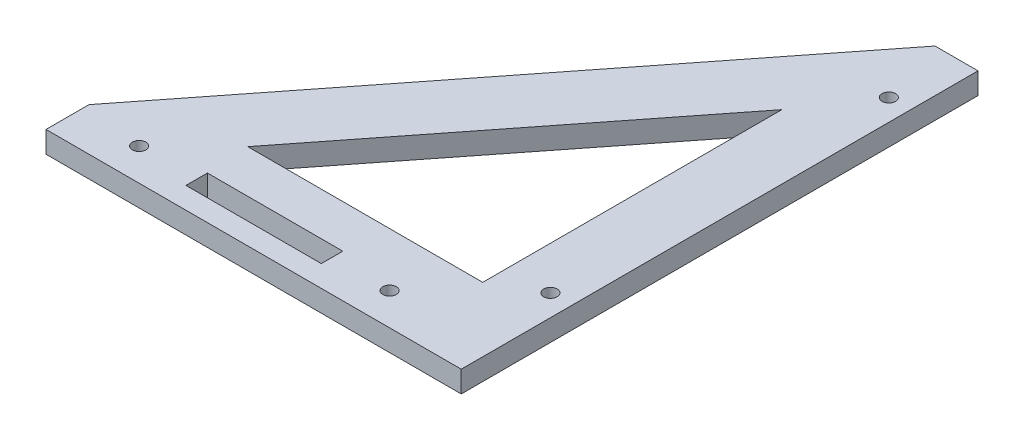
ISO-10303-21;
HEADER;
FILE_DESCRIPTION(('STEP AP214'),'2;1');
FILE_NAME('part.step','',(''),(''),'','','');
FILE_SCHEMA(('AUTOMOTIVE_DESIGN { 1 0 10303 214 1 1 1 1 }'));
ENDSEC;
DATA;
#1=APPLICATION_CONTEXT('core data for automotive mechanical design processes');
#2=APPLICATION_PROTOCOL_DEFINITION('international standard','automotive_design',2000,#1);
#3=PRODUCT_CONTEXT('',#1,'mechanical');
#4=PRODUCT('Part','Part','',(#3));
#5=PRODUCT_RELATED_PRODUCT_CATEGORY('part','',(#4));
#6=PRODUCT_DEFINITION_FORMATION('','',#4);
#7=PRODUCT_DEFINITION_CONTEXT('part definition',#1,'design');
#8=PRODUCT_DEFINITION('design','',#6,#7);
#9=PRODUCT_DEFINITION_SHAPE('','',#8);
#10=(LENGTH_UNIT() NAMED_UNIT(*) SI_UNIT(.MILLI.,.METRE.));
#11=(NAMED_UNIT(*) PLANE_ANGLE_UNIT() SI_UNIT($,.RADIAN.));
#12=(NAMED_UNIT(*) SI_UNIT($,.STERADIAN.) SOLID_ANGLE_UNIT());
#13=UNCERTAINTY_MEASURE_WITH_UNIT(LENGTH_MEASURE(1.E-05),#10,'distance_accuracy_value','');
#14=(GEOMETRIC_REPRESENTATION_CONTEXT(3) GLOBAL_UNCERTAINTY_ASSIGNED_CONTEXT((#13)) GLOBAL_UNIT_ASSIGNED_CONTEXT((#10,
#11,#12)) REPRESENTATION_CONTEXT('',''));
#15=CARTESIAN_POINT('',(0.,0.,0.));
#16=DIRECTION('',(0.,0.,1.));
#17=DIRECTION('',(1.,0.,0.));
#18=AXIS2_PLACEMENT_3D('',#15,#16,#17);
#19=CARTESIAN_POINT('',(55.,3.175,-70.));
#20=DIRECTION('',(0.786318338822423,0.,0.617821551931903));
#21=DIRECTION('',(0.617821551931903,0.,-0.786318338822423));
#22=AXIS2_PLACEMENT_3D('',#19,#20,#21);
#23=PLANE('',#22);
#24=DIRECTION('',(-0.617821551931903,0.,0.786318338822423));
#25=VECTOR('',#24,1.);
#26=CARTESIAN_POINT('',(55.,0.,-70.));
#27=LINE('',#26,#25);
#28=CARTESIAN_POINT('',(55.,0.,-70.));
#29=VERTEX_POINT('',#28);
#30=CARTESIAN_POINT('',(0.,0.,0.));
#31=VERTEX_POINT('',#30);
#32=EDGE_CURVE('E234',#29,#31,#27,.T.);
#33=ORIENTED_EDGE('',*,*,#32,.T.);
#34=DIRECTION('',(0.,-1.,0.));
#35=VECTOR('',#34,1.);
#36=CARTESIAN_POINT('',(0.,3.175,0.));
#37=LINE('',#36,#35);
#38=CARTESIAN_POINT('',(0.,3.175,0.));
#39=VERTEX_POINT('',#38);
#40=EDGE_CURVE('E11',#39,#31,#37,.T.);
#41=ORIENTED_EDGE('',*,*,#40,.F.);
#42=DIRECTION('',(-0.617821551931903,0.,0.786318338822423));
#43=VECTOR('',#42,1.);
#44=CARTESIAN_POINT('',(55.,3.175,-70.));
#45=LINE('',#44,#43);
#46=CARTESIAN_POINT('',(55.,3.175,-70.));
#47=VERTEX_POINT('',#46);
#48=EDGE_CURVE('E235',#47,#39,#45,.T.);
#49=ORIENTED_EDGE('',*,*,#48,.F.);
#50=DIRECTION('',(0.,-1.,0.));
#51=VECTOR('',#50,1.);
#52=CARTESIAN_POINT('',(55.,3.175,-70.));
#53=LINE('',#52,#51);
#54=EDGE_CURVE('E39',#47,#29,#53,.T.);
#55=ORIENTED_EDGE('',*,*,#54,.T.);
#56=EDGE_LOOP('',(#33,#41,#49,#55));
#57=FACE_BOUND('',#56,.T.);
#58=ADVANCED_FACE('F32',(#57),#23,.F.);
#59=CARTESIAN_POINT('',(0.,3.175,0.));
#60=DIRECTION('',(0.,1.,0.));
#61=DIRECTION('',(0.,0.,1.));
#62=AXIS2_PLACEMENT_3D('',#59,#60,#61);
#63=PLANE('',#62);
#64=DIRECTION('',(0.,0.,-1.));
#65=VECTOR('',#64,1.);
#66=CARTESIAN_POINT('',(51.825,3.175,-50.5420178558514));
#67=LINE('',#66,#65);
#68=CARTESIAN_POINT('',(51.825,3.175,-6.35));
#69=VERTEX_POINT('',#68);
#70=CARTESIAN_POINT('',(51.825,3.175,-50.5420178558514));
#71=VERTEX_POINT('',#70);
#72=EDGE_CURVE('E46',#69,#71,#67,.T.);
#73=ORIENTED_EDGE('',*,*,#72,.F.);
#74=DIRECTION('',(1.,0.,0.));
#75=VECTOR('',#74,1.);
#76=CARTESIAN_POINT('',(51.825,3.175,-6.35));
#77=LINE('',#76,#75);
#78=CARTESIAN_POINT('',(17.1027002561168,3.175,-6.34999999999999));
#79=VERTEX_POINT('',#78);
#80=EDGE_CURVE('E135',#79,#69,#77,.T.);
#81=ORIENTED_EDGE('',*,*,#80,.F.);
#82=DIRECTION('',(-0.617821551931903,0.,0.786318338822423));
#83=VECTOR('',#82,1.);
#84=CARTESIAN_POINT('',(17.1027002561168,3.175,-6.34999999999999));
#85=LINE('',#84,#83);
#86=EDGE_CURVE('E138',#71,#79,#85,.T.);
#87=ORIENTED_EDGE('',*,*,#86,.F.);
#88=EDGE_LOOP('',(#73,#81,#87));
#89=FACE_BOUND('',#88,.T.);
#90=CARTESIAN_POINT('',(9.,3.175,1.5875));
#91=DIRECTION('',(0.,1.,0.));
#92=DIRECTION('',(0.,0.,1.));
#93=AXIS2_PLACEMENT_3D('',#90,#91,#92);
#94=CIRCLE('',#93,0.999999999999998);
#95=CARTESIAN_POINT('',(9.,3.175,2.5875));
#96=VERTEX_POINT('',#95);
#97=EDGE_CURVE('E152',#96,#96,#94,.T.);
#98=ORIENTED_EDGE('',*,*,#97,.F.);
#99=EDGE_LOOP('',(#98));
#100=FACE_BOUND('',#99,.T.);
#101=CARTESIAN_POINT('',(46.,3.175,1.5875));
#102=DIRECTION('',(0.,1.,0.));
#103=DIRECTION('',(0.,0.,1.));
#104=AXIS2_PLACEMENT_3D('',#101,#102,#103);
#105=CIRCLE('',#104,0.999999999999998);
#106=CARTESIAN_POINT('',(46.,3.175,2.5875));
#107=VERTEX_POINT('',#106);
#108=EDGE_CURVE('E158',#107,#107,#105,.T.);
#109=ORIENTED_EDGE('',*,*,#108,.F.);
#110=EDGE_LOOP('',(#109));
#111=FACE_BOUND('',#110,.T.);
#112=DIRECTION('',(0.,0.,-1.));
#113=VECTOR('',#112,1.);
#114=CARTESIAN_POINT('',(37.5,3.175,3.175));
#115=LINE('',#114,#113);
#116=CARTESIAN_POINT('',(37.5,3.175,3.175));
#117=VERTEX_POINT('',#116);
#118=CARTESIAN_POINT('',(37.5,3.175,0.));
#119=VERTEX_POINT('',#118);
#120=EDGE_CURVE('E176',#117,#119,#115,.T.);
#121=ORIENTED_EDGE('',*,*,#120,.F.);
#122=DIRECTION('',(1.,0.,0.));
#123=VECTOR('',#122,1.);
#124=CARTESIAN_POINT('',(17.5,3.175,3.175));
#125=LINE('',#124,#123);
#126=CARTESIAN_POINT('',(17.5,3.175,3.175));
#127=VERTEX_POINT('',#126);
#128=EDGE_CURVE('E166',#127,#117,#125,.T.);
#129=ORIENTED_EDGE('',*,*,#128,.F.);
#130=DIRECTION('',(0.,0.,1.));
#131=VECTOR('',#130,1.);
#132=CARTESIAN_POINT('',(17.5,3.175,3.175));
#133=LINE('',#132,#131);
#134=CARTESIAN_POINT('',(17.5,3.175,0.));
#135=VERTEX_POINT('',#134);
#136=EDGE_CURVE('E182',#135,#127,#133,.T.);
#137=ORIENTED_EDGE('',*,*,#136,.F.);
#138=DIRECTION('',(-1.,0.,0.));
#139=VECTOR('',#138,1.);
#140=CARTESIAN_POINT('',(17.5,3.175,0.));
#141=LINE('',#140,#139);
#142=EDGE_CURVE('E178',#119,#135,#141,.T.);
#143=ORIENTED_EDGE('',*,*,#142,.F.);
#144=EDGE_LOOP('',(#121,#129,#137,#143));
#145=FACE_BOUND('',#144,.T.);
#146=CARTESIAN_POINT('',(58.175,3.175,-60.));
#147=DIRECTION('',(0.,1.,0.));
#148=DIRECTION('',(0.,0.,1.));
#149=AXIS2_PLACEMENT_3D('',#146,#147,#148);
#150=CIRCLE('',#149,1.00000000000001);
#151=CARTESIAN_POINT('',(58.175,3.175,-59.));
#152=VERTEX_POINT('',#151);
#153=EDGE_CURVE('E196',#152,#152,#150,.T.);
#154=ORIENTED_EDGE('',*,*,#153,.F.);
#155=EDGE_LOOP('',(#154));
#156=FACE_BOUND('',#155,.T.);
#157=CARTESIAN_POINT('',(58.175,3.175,-10.));
#158=DIRECTION('',(0.,1.,0.));
#159=DIRECTION('',(0.,0.,1.));
#160=AXIS2_PLACEMENT_3D('',#157,#158,#159);
#161=CIRCLE('',#160,0.999999999999998);
#162=CARTESIAN_POINT('',(58.175,3.175,-9.00000000000001));
#163=VERTEX_POINT('',#162);
#164=EDGE_CURVE('E146',#163,#163,#161,.T.);
#165=ORIENTED_EDGE('',*,*,#164,.F.);
#166=EDGE_LOOP('',(#165));
#167=FACE_BOUND('',#166,.T.);
#168=ORIENTED_EDGE('',*,*,#48,.T.);
#169=DIRECTION('',(0.,0.,-1.));
#170=VECTOR('',#169,1.);
#171=CARTESIAN_POINT('',(0.,3.175,0.));
#172=LINE('',#171,#170);
#173=CARTESIAN_POINT('',(0.,3.175,6.35));
#174=VERTEX_POINT('',#173);
#175=EDGE_CURVE('E221',#174,#39,#172,.T.);
#176=ORIENTED_EDGE('',*,*,#175,.F.);
#177=DIRECTION('',(-1.,0.,0.));
#178=VECTOR('',#177,1.);
#179=CARTESIAN_POINT('',(0.,3.175,6.35));
#180=LINE('',#179,#178);
#181=CARTESIAN_POINT('',(61.35,3.175,6.35));
#182=VERTEX_POINT('',#181);
#183=EDGE_CURVE('E224',#182,#174,#180,.T.);
#184=ORIENTED_EDGE('',*,*,#183,.F.);
#185=DIRECTION('',(0.,0.,1.));
#186=VECTOR('',#185,1.);
#187=CARTESIAN_POINT('',(61.35,3.175,6.35));
#188=LINE('',#187,#186);
#189=CARTESIAN_POINT('',(61.35,3.175,-70.));
#190=VERTEX_POINT('',#189);
#191=EDGE_CURVE('E207',#190,#182,#188,.T.);
#192=ORIENTED_EDGE('',*,*,#191,.F.);
#193=DIRECTION('',(1.,0.,0.));
#194=VECTOR('',#193,1.);
#195=CARTESIAN_POINT('',(55.,3.175,-70.));
#196=LINE('',#195,#194);
#197=EDGE_CURVE('E204',#47,#190,#196,.T.);
#198=ORIENTED_EDGE('',*,*,#197,.F.);
#199=EDGE_LOOP('',(#168,#176,#184,#192,#198));
#200=FACE_BOUND('',#199,.T.);
#201=ADVANCED_FACE('F258',(#89,#100,#111,#145,#156,#167,#200),#63,.T.);
#202=CARTESIAN_POINT('',(0.,0.,0.));
#203=DIRECTION('',(0.,1.,0.));
#204=DIRECTION('',(0.,0.,1.));
#205=AXIS2_PLACEMENT_3D('',#202,#203,#204);
#206=PLANE('',#205);
#207=DIRECTION('',(1.,0.,0.));
#208=VECTOR('',#207,1.);
#209=CARTESIAN_POINT('',(51.825,0.,-6.35));
#210=LINE('',#209,#208);
#211=CARTESIAN_POINT('',(17.1027002561168,0.,-6.35));
#212=VERTEX_POINT('',#211);
#213=CARTESIAN_POINT('',(51.825,0.,-6.35));
#214=VERTEX_POINT('',#213);
#215=EDGE_CURVE('E54',#212,#214,#210,.T.);
#216=ORIENTED_EDGE('',*,*,#215,.T.);
#217=DIRECTION('',(0.,0.,-1.));
#218=VECTOR('',#217,1.);
#219=CARTESIAN_POINT('',(51.825,0.,-50.5420178558514));
#220=LINE('',#219,#218);
#221=CARTESIAN_POINT('',(51.825,0.,-50.5420178558514));
#222=VERTEX_POINT('',#221);
#223=EDGE_CURVE('E122',#214,#222,#220,.T.);
#224=ORIENTED_EDGE('',*,*,#223,.T.);
#225=DIRECTION('',(-0.617821551931903,0.,0.786318338822423));
#226=VECTOR('',#225,1.);
#227=CARTESIAN_POINT('',(17.1027002561168,0.,-6.34999999999999));
#228=LINE('',#227,#226);
#229=EDGE_CURVE('E129',#222,#212,#228,.T.);
#230=ORIENTED_EDGE('',*,*,#229,.T.);
#231=EDGE_LOOP('',(#216,#224,#230));
#232=FACE_BOUND('',#231,.T.);
#233=CARTESIAN_POINT('',(9.,0.,1.5875));
#234=DIRECTION('',(0.,1.,0.));
#235=DIRECTION('',(0.,0.,1.));
#236=AXIS2_PLACEMENT_3D('',#233,#234,#235);
#237=CIRCLE('',#236,0.999999999999998);
#238=CARTESIAN_POINT('',(9.,0.,2.5875));
#239=VERTEX_POINT('',#238);
#240=EDGE_CURVE('E148',#239,#239,#237,.T.);
#241=ORIENTED_EDGE('',*,*,#240,.T.);
#242=EDGE_LOOP('',(#241));
#243=FACE_BOUND('',#242,.T.);
#244=CARTESIAN_POINT('',(46.,0.,1.5875));
#245=DIRECTION('',(0.,1.,0.));
#246=DIRECTION('',(0.,0.,1.));
#247=AXIS2_PLACEMENT_3D('',#244,#245,#246);
#248=CIRCLE('',#247,0.999999999999998);
#249=CARTESIAN_POINT('',(46.,0.,2.5875));
#250=VERTEX_POINT('',#249);
#251=EDGE_CURVE('E155',#250,#250,#248,.T.);
#252=ORIENTED_EDGE('',*,*,#251,.T.);
#253=EDGE_LOOP('',(#252));
#254=FACE_BOUND('',#253,.T.);
#255=DIRECTION('',(1.,0.,0.));
#256=VECTOR('',#255,1.);
#257=CARTESIAN_POINT('',(17.5,0.,3.175));
#258=LINE('',#257,#256);
#259=CARTESIAN_POINT('',(17.5,0.,3.175));
#260=VERTEX_POINT('',#259);
#261=CARTESIAN_POINT('',(37.5,0.,3.175));
#262=VERTEX_POINT('',#261);
#263=EDGE_CURVE('E172',#260,#262,#258,.T.);
#264=ORIENTED_EDGE('',*,*,#263,.T.);
#265=DIRECTION('',(0.,0.,-1.));
#266=VECTOR('',#265,1.);
#267=CARTESIAN_POINT('',(37.5,0.,3.175));
#268=LINE('',#267,#266);
#269=CARTESIAN_POINT('',(37.5,0.,0.));
#270=VERTEX_POINT('',#269);
#271=EDGE_CURVE('E162',#262,#270,#268,.T.);
#272=ORIENTED_EDGE('',*,*,#271,.T.);
#273=DIRECTION('',(-1.,0.,0.));
#274=VECTOR('',#273,1.);
#275=CARTESIAN_POINT('',(17.5,0.,0.));
#276=LINE('',#275,#274);
#277=CARTESIAN_POINT('',(17.5,0.,0.));
#278=VERTEX_POINT('',#277);
#279=EDGE_CURVE('E165',#270,#278,#276,.T.);
#280=ORIENTED_EDGE('',*,*,#279,.T.);
#281=DIRECTION('',(0.,0.,1.));
#282=VECTOR('',#281,1.);
#283=CARTESIAN_POINT('',(17.5,0.,3.175));
#284=LINE('',#283,#282);
#285=EDGE_CURVE('E169',#278,#260,#284,.T.);
#286=ORIENTED_EDGE('',*,*,#285,.T.);
#287=EDGE_LOOP('',(#264,#272,#280,#286));
#288=FACE_BOUND('',#287,.T.);
#289=CARTESIAN_POINT('',(58.175,0.,-60.));
#290=DIRECTION('',(0.,1.,0.));
#291=DIRECTION('',(0.,0.,1.));
#292=AXIS2_PLACEMENT_3D('',#289,#290,#291);
#293=CIRCLE('',#292,1.00000000000001);
#294=CARTESIAN_POINT('',(58.175,0.,-59.));
#295=VERTEX_POINT('',#294);
#296=EDGE_CURVE('E179',#295,#295,#293,.T.);
#297=ORIENTED_EDGE('',*,*,#296,.T.);
#298=EDGE_LOOP('',(#297));
#299=FACE_BOUND('',#298,.T.);
#300=CARTESIAN_POINT('',(58.175,0.,-10.));
#301=DIRECTION('',(0.,1.,0.));
#302=DIRECTION('',(0.,0.,1.));
#303=AXIS2_PLACEMENT_3D('',#300,#301,#302);
#304=CIRCLE('',#303,0.999999999999998);
#305=CARTESIAN_POINT('',(58.175,0.,-9.00000000000001));
#306=VERTEX_POINT('',#305);
#307=EDGE_CURVE('E199',#306,#306,#304,.T.);
#308=ORIENTED_EDGE('',*,*,#307,.T.);
#309=EDGE_LOOP('',(#308));
#310=FACE_BOUND('',#309,.T.);
#311=ORIENTED_EDGE('',*,*,#32,.F.);
#312=DIRECTION('',(1.,0.,0.));
#313=VECTOR('',#312,1.);
#314=CARTESIAN_POINT('',(55.,0.,-70.));
#315=LINE('',#314,#313);
#316=CARTESIAN_POINT('',(61.35,0.,-70.));
#317=VERTEX_POINT('',#316);
#318=EDGE_CURVE('E151',#29,#317,#315,.T.);
#319=ORIENTED_EDGE('',*,*,#318,.T.);
#320=DIRECTION('',(0.,0.,1.));
#321=VECTOR('',#320,1.);
#322=CARTESIAN_POINT('',(61.35,0.,6.35));
#323=LINE('',#322,#321);
#324=CARTESIAN_POINT('',(61.35,0.,6.35));
#325=VERTEX_POINT('',#324);
#326=EDGE_CURVE('E208',#317,#325,#323,.T.);
#327=ORIENTED_EDGE('',*,*,#326,.T.);
#328=DIRECTION('',(-1.,0.,0.));
#329=VECTOR('',#328,1.);
#330=CARTESIAN_POINT('',(0.,0.,6.35));
#331=LINE('',#330,#329);
#332=CARTESIAN_POINT('',(0.,0.,6.35));
#333=VERTEX_POINT('',#332);
#334=EDGE_CURVE('E225',#325,#333,#331,.T.);
#335=ORIENTED_EDGE('',*,*,#334,.T.);
#336=DIRECTION('',(0.,0.,-1.));
#337=VECTOR('',#336,1.);
#338=CARTESIAN_POINT('',(0.,0.,0.));
#339=LINE('',#338,#337);
#340=EDGE_CURVE('E219',#333,#31,#339,.T.);
#341=ORIENTED_EDGE('',*,*,#340,.T.);
#342=EDGE_LOOP('',(#311,#319,#327,#335,#341));
#343=FACE_BOUND('',#342,.T.);
#344=ADVANCED_FACE('F133',(#232,#243,#254,#288,#299,#310,#343),#206,.F.);
#345=CARTESIAN_POINT('',(0.,3.175,0.));
#346=DIRECTION('',(-1.,0.,0.));
#347=DIRECTION('',(0.,0.,1.));
#348=AXIS2_PLACEMENT_3D('',#345,#346,#347);
#349=PLANE('',#348);
#350=ORIENTED_EDGE('',*,*,#340,.F.);
#351=DIRECTION('',(0.,-1.,0.));
#352=VECTOR('',#351,1.);
#353=CARTESIAN_POINT('',(0.,3.175,6.35));
#354=LINE('',#353,#352);
#355=EDGE_CURVE('E228',#174,#333,#354,.T.);
#356=ORIENTED_EDGE('',*,*,#355,.F.);
#357=ORIENTED_EDGE('',*,*,#175,.T.);
#358=ORIENTED_EDGE('',*,*,#40,.T.);
#359=EDGE_LOOP('',(#350,#356,#357,#358));
#360=FACE_BOUND('',#359,.T.);
#361=ADVANCED_FACE('F256',(#360),#349,.T.);
#362=CARTESIAN_POINT('',(0.,3.175,6.35));
#363=DIRECTION('',(0.,0.,1.));
#364=DIRECTION('',(1.,0.,0.));
#365=AXIS2_PLACEMENT_3D('',#362,#363,#364);
#366=PLANE('',#365);
#367=ORIENTED_EDGE('',*,*,#334,.F.);
#368=DIRECTION('',(0.,-1.,0.));
#369=VECTOR('',#368,1.);
#370=CARTESIAN_POINT('',(61.35,3.175,6.35));
#371=LINE('',#370,#369);
#372=EDGE_CURVE('E216',#182,#325,#371,.T.);
#373=ORIENTED_EDGE('',*,*,#372,.F.);
#374=ORIENTED_EDGE('',*,*,#183,.T.);
#375=ORIENTED_EDGE('',*,*,#355,.T.);
#376=EDGE_LOOP('',(#367,#373,#374,#375));
#377=FACE_BOUND('',#376,.T.);
#378=ADVANCED_FACE('F253',(#377),#366,.T.);
#379=CARTESIAN_POINT('',(61.35,3.175,6.35));
#380=DIRECTION('',(1.,0.,0.));
#381=DIRECTION('',(0.,0.,-1.));
#382=AXIS2_PLACEMENT_3D('',#379,#380,#381);
#383=PLANE('',#382);
#384=ORIENTED_EDGE('',*,*,#326,.F.);
#385=DIRECTION('',(0.,-1.,0.));
#386=VECTOR('',#385,1.);
#387=CARTESIAN_POINT('',(61.35,3.175,-70.));
#388=LINE('',#387,#386);
#389=EDGE_CURVE('E211',#190,#317,#388,.T.);
#390=ORIENTED_EDGE('',*,*,#389,.F.);
#391=ORIENTED_EDGE('',*,*,#191,.T.);
#392=ORIENTED_EDGE('',*,*,#372,.T.);
#393=EDGE_LOOP('',(#384,#390,#391,#392));
#394=FACE_BOUND('',#393,.T.);
#395=ADVANCED_FACE('F250',(#394),#383,.T.);
#396=CARTESIAN_POINT('',(55.,3.175,-70.));
#397=DIRECTION('',(0.,0.,-1.));
#398=DIRECTION('',(-1.,0.,0.));
#399=AXIS2_PLACEMENT_3D('',#396,#397,#398);
#400=PLANE('',#399);
#401=ORIENTED_EDGE('',*,*,#318,.F.);
#402=ORIENTED_EDGE('',*,*,#54,.F.);
#403=ORIENTED_EDGE('',*,*,#197,.T.);
#404=ORIENTED_EDGE('',*,*,#389,.T.);
#405=EDGE_LOOP('',(#401,#402,#403,#404));
#406=FACE_BOUND('',#405,.T.);
#407=ADVANCED_FACE('F246',(#406),#400,.T.);
#408=CARTESIAN_POINT('',(58.175,0.,-10.));
#409=DIRECTION('',(0.,1.,0.));
#410=DIRECTION('',(0.,0.,1.));
#411=AXIS2_PLACEMENT_3D('',#408,#409,#410);
#412=CYLINDRICAL_SURFACE('',#411,0.999999999999998);
#413=ORIENTED_EDGE('',*,*,#307,.F.);
#414=EDGE_LOOP('',(#413));
#415=FACE_BOUND('',#414,.T.);
#416=ORIENTED_EDGE('',*,*,#164,.T.);
#417=EDGE_LOOP('',(#416));
#418=FACE_BOUND('',#417,.T.);
#419=ADVANCED_FACE('F274',(#415,#418),#412,.F.);
#420=CARTESIAN_POINT('',(58.175,0.,-60.));
#421=DIRECTION('',(0.,1.,0.));
#422=DIRECTION('',(0.,0.,1.));
#423=AXIS2_PLACEMENT_3D('',#420,#421,#422);
#424=CYLINDRICAL_SURFACE('',#423,1.00000000000001);
#425=ORIENTED_EDGE('',*,*,#296,.F.);
#426=EDGE_LOOP('',(#425));
#427=FACE_BOUND('',#426,.T.);
#428=ORIENTED_EDGE('',*,*,#153,.T.);
#429=EDGE_LOOP('',(#428));
#430=FACE_BOUND('',#429,.T.);
#431=ADVANCED_FACE('F279',(#427,#430),#424,.F.);
#432=CARTESIAN_POINT('',(37.5,0.,3.175));
#433=DIRECTION('',(1.,0.,0.));
#434=DIRECTION('',(0.,0.,-1.));
#435=AXIS2_PLACEMENT_3D('',#432,#433,#434);
#436=PLANE('',#435);
#437=ORIENTED_EDGE('',*,*,#120,.T.);
#438=DIRECTION('',(0.,1.,0.));
#439=VECTOR('',#438,1.);
#440=CARTESIAN_POINT('',(37.5,0.,0.));
#441=LINE('',#440,#439);
#442=EDGE_CURVE('E175',#270,#119,#441,.T.);
#443=ORIENTED_EDGE('',*,*,#442,.F.);
#444=ORIENTED_EDGE('',*,*,#271,.F.);
#445=DIRECTION('',(0.,1.,0.));
#446=VECTOR('',#445,1.);
#447=CARTESIAN_POINT('',(37.5,0.,3.175));
#448=LINE('',#447,#446);
#449=EDGE_CURVE('E161',#262,#117,#448,.T.);
#450=ORIENTED_EDGE('',*,*,#449,.T.);
#451=EDGE_LOOP('',(#437,#443,#444,#450));
#452=FACE_BOUND('',#451,.T.);
#453=ADVANCED_FACE('F283',(#452),#436,.F.);
#454=CARTESIAN_POINT('',(17.5,0.,3.175));
#455=DIRECTION('',(0.,0.,1.));
#456=DIRECTION('',(1.,0.,0.));
#457=AXIS2_PLACEMENT_3D('',#454,#455,#456);
#458=PLANE('',#457);
#459=ORIENTED_EDGE('',*,*,#128,.T.);
#460=ORIENTED_EDGE('',*,*,#449,.F.);
#461=ORIENTED_EDGE('',*,*,#263,.F.);
#462=DIRECTION('',(0.,1.,0.));
#463=VECTOR('',#462,1.);
#464=CARTESIAN_POINT('',(17.5,0.,3.175));
#465=LINE('',#464,#463);
#466=EDGE_CURVE('E188',#260,#127,#465,.T.);
#467=ORIENTED_EDGE('',*,*,#466,.T.);
#468=EDGE_LOOP('',(#459,#460,#461,#467));
#469=FACE_BOUND('',#468,.T.);
#470=ADVANCED_FACE('F287',(#469),#458,.F.);
#471=CARTESIAN_POINT('',(17.5,0.,3.175));
#472=DIRECTION('',(-1.,0.,0.));
#473=DIRECTION('',(0.,0.,1.));
#474=AXIS2_PLACEMENT_3D('',#471,#472,#473);
#475=PLANE('',#474);
#476=ORIENTED_EDGE('',*,*,#136,.T.);
#477=ORIENTED_EDGE('',*,*,#466,.F.);
#478=ORIENTED_EDGE('',*,*,#285,.F.);
#479=DIRECTION('',(0.,1.,0.));
#480=VECTOR('',#479,1.);
#481=CARTESIAN_POINT('',(17.5,0.,0.));
#482=LINE('',#481,#480);
#483=EDGE_CURVE('E190',#278,#135,#482,.T.);
#484=ORIENTED_EDGE('',*,*,#483,.T.);
#485=EDGE_LOOP('',(#476,#477,#478,#484));
#486=FACE_BOUND('',#485,.T.);
#487=ADVANCED_FACE('F293',(#486),#475,.F.);
#488=CARTESIAN_POINT('',(17.5,0.,0.));
#489=DIRECTION('',(0.,0.,-1.));
#490=DIRECTION('',(-1.,0.,0.));
#491=AXIS2_PLACEMENT_3D('',#488,#489,#490);
#492=PLANE('',#491);
#493=ORIENTED_EDGE('',*,*,#142,.T.);
#494=ORIENTED_EDGE('',*,*,#483,.F.);
#495=ORIENTED_EDGE('',*,*,#279,.F.);
#496=ORIENTED_EDGE('',*,*,#442,.T.);
#497=EDGE_LOOP('',(#493,#494,#495,#496));
#498=FACE_BOUND('',#497,.T.);
#499=ADVANCED_FACE('F289',(#498),#492,.F.);
#500=CARTESIAN_POINT('',(46.,0.,1.5875));
#501=DIRECTION('',(0.,1.,0.));
#502=DIRECTION('',(0.,0.,1.));
#503=AXIS2_PLACEMENT_3D('',#500,#501,#502);
#504=CYLINDRICAL_SURFACE('',#503,0.999999999999998);
#505=ORIENTED_EDGE('',*,*,#251,.F.);
#506=EDGE_LOOP('',(#505));
#507=FACE_BOUND('',#506,.T.);
#508=ORIENTED_EDGE('',*,*,#108,.T.);
#509=EDGE_LOOP('',(#508));
#510=FACE_BOUND('',#509,.T.);
#511=ADVANCED_FACE('F292',(#507,#510),#504,.F.);
#512=CARTESIAN_POINT('',(9.,0.,1.5875));
#513=DIRECTION('',(0.,1.,0.));
#514=DIRECTION('',(0.,0.,1.));
#515=AXIS2_PLACEMENT_3D('',#512,#513,#514);
#516=CYLINDRICAL_SURFACE('',#515,0.999999999999998);
#517=ORIENTED_EDGE('',*,*,#240,.F.);
#518=EDGE_LOOP('',(#517));
#519=FACE_BOUND('',#518,.T.);
#520=ORIENTED_EDGE('',*,*,#97,.T.);
#521=EDGE_LOOP('',(#520));
#522=FACE_BOUND('',#521,.T.);
#523=ADVANCED_FACE('F303',(#519,#522),#516,.F.);
#524=CARTESIAN_POINT('',(51.825,0.,-50.5420178558514));
#525=DIRECTION('',(1.,0.,0.));
#526=DIRECTION('',(0.,0.,-1.));
#527=AXIS2_PLACEMENT_3D('',#524,#525,#526);
#528=PLANE('',#527);
#529=ORIENTED_EDGE('',*,*,#72,.T.);
#530=DIRECTION('',(0.,1.,0.));
#531=VECTOR('',#530,1.);
#532=CARTESIAN_POINT('',(51.825,0.,-50.5420178558514));
#533=LINE('',#532,#531);
#534=EDGE_CURVE('E118',#222,#71,#533,.T.);
#535=ORIENTED_EDGE('',*,*,#534,.F.);
#536=ORIENTED_EDGE('',*,*,#223,.F.);
#537=DIRECTION('',(0.,1.,0.));
#538=VECTOR('',#537,1.);
#539=CARTESIAN_POINT('',(51.825,0.,-6.35));
#540=LINE('',#539,#538);
#541=EDGE_CURVE('E144',#214,#69,#540,.T.);
#542=ORIENTED_EDGE('',*,*,#541,.T.);
#543=EDGE_LOOP('',(#529,#535,#536,#542));
#544=FACE_BOUND('',#543,.T.);
#545=ADVANCED_FACE('F120',(#544),#528,.F.);
#546=CARTESIAN_POINT('',(51.825,0.,-6.35));
#547=DIRECTION('',(0.,0.,1.));
#548=DIRECTION('',(1.,0.,0.));
#549=AXIS2_PLACEMENT_3D('',#546,#547,#548);
#550=PLANE('',#549);
#551=ORIENTED_EDGE('',*,*,#80,.T.);
#552=ORIENTED_EDGE('',*,*,#541,.F.);
#553=ORIENTED_EDGE('',*,*,#215,.F.);
#554=DIRECTION('',(0.,1.,0.));
#555=VECTOR('',#554,1.);
#556=CARTESIAN_POINT('',(17.1027002561168,0.,-6.34999999999999));
#557=LINE('',#556,#555);
#558=EDGE_CURVE('E126',#212,#79,#557,.T.);
#559=ORIENTED_EDGE('',*,*,#558,.T.);
#560=EDGE_LOOP('',(#551,#552,#553,#559));
#561=FACE_BOUND('',#560,.T.);
#562=ADVANCED_FACE('F310',(#561),#550,.F.);
#563=CARTESIAN_POINT('',(17.1027002561168,0.,-6.34999999999999));
#564=DIRECTION('',(-0.786318338822423,0.,-0.617821551931903));
#565=DIRECTION('',(-0.617821551931904,0.,0.786318338822423));
#566=AXIS2_PLACEMENT_3D('',#563,#564,#565);
#567=PLANE('',#566);
#568=ORIENTED_EDGE('',*,*,#86,.T.);
#569=ORIENTED_EDGE('',*,*,#558,.F.);
#570=ORIENTED_EDGE('',*,*,#229,.F.);
#571=ORIENTED_EDGE('',*,*,#534,.T.);
#572=EDGE_LOOP('',(#568,#569,#570,#571));
#573=FACE_BOUND('',#572,.T.);
#574=ADVANCED_FACE('F130',(#573),#567,.F.);
#575=CLOSED_SHELL('',(#58,#201,#344,#361,#378,#395,#407,#419,#431,#453,#470,#487,#499,#511,#523,
#545,#562,#574));
#576=MANIFOLD_SOLID_BREP('B2',#575);
#577=ADVANCED_BREP_SHAPE_REPRESENTATION('',(#18,#576),#14);
#578=SHAPE_DEFINITION_REPRESENTATION(#9,#577);
ENDSEC;
END-ISO-10303-21;
